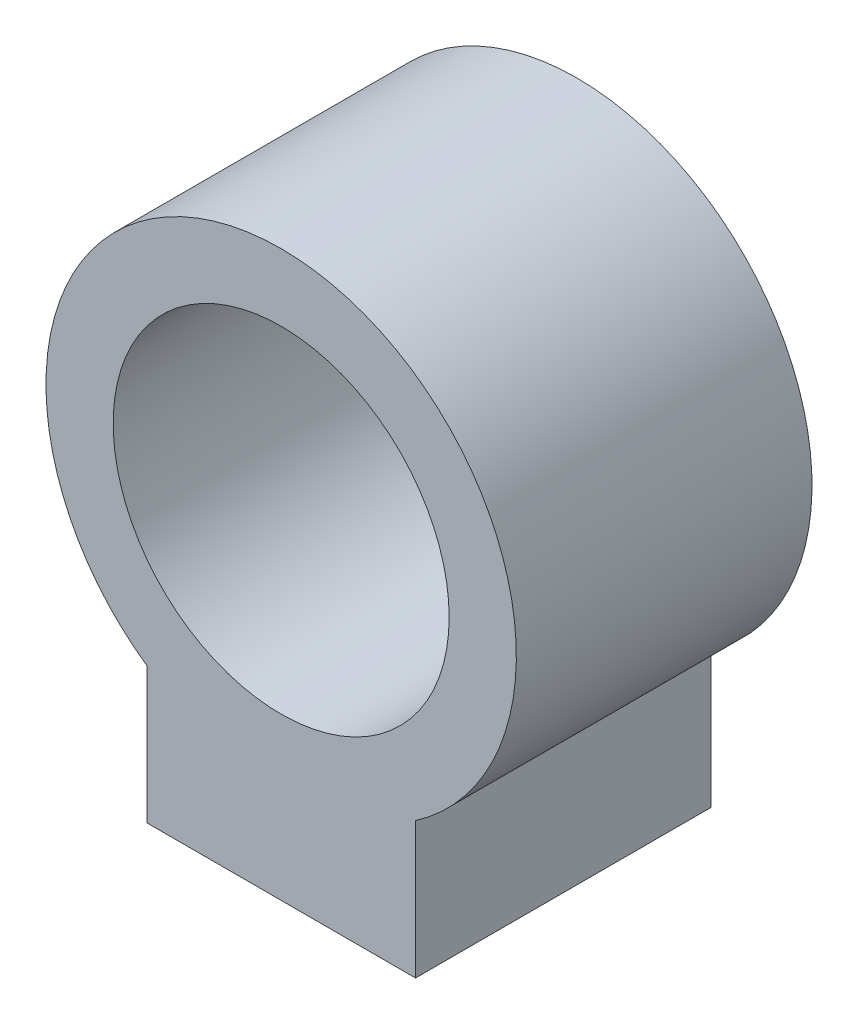
ISO-10303-21;
HEADER;
FILE_DESCRIPTION(('STEP AP214'),'2;1');
FILE_NAME('part.step','',(''),(''),'','','');
FILE_SCHEMA(('AUTOMOTIVE_DESIGN { 1 0 10303 214 1 1 1 1 }'));
ENDSEC;
DATA;
#1=APPLICATION_CONTEXT('core data for automotive mechanical design processes');
#2=APPLICATION_PROTOCOL_DEFINITION('international standard','automotive_design',2000,#1);
#3=PRODUCT_CONTEXT('',#1,'mechanical');
#4=PRODUCT('Part','Part','',(#3));
#5=PRODUCT_RELATED_PRODUCT_CATEGORY('part','',(#4));
#6=PRODUCT_DEFINITION_FORMATION('','',#4);
#7=PRODUCT_DEFINITION_CONTEXT('part definition',#1,'design');
#8=PRODUCT_DEFINITION('design','',#6,#7);
#9=PRODUCT_DEFINITION_SHAPE('','',#8);
#10=(LENGTH_UNIT() NAMED_UNIT(*) SI_UNIT(.MILLI.,.METRE.));
#11=(NAMED_UNIT(*) PLANE_ANGLE_UNIT() SI_UNIT($,.RADIAN.));
#12=(NAMED_UNIT(*) SI_UNIT($,.STERADIAN.) SOLID_ANGLE_UNIT());
#13=UNCERTAINTY_MEASURE_WITH_UNIT(LENGTH_MEASURE(1.E-05),#10,'distance_accuracy_value','');
#14=(GEOMETRIC_REPRESENTATION_CONTEXT(3) GLOBAL_UNCERTAINTY_ASSIGNED_CONTEXT((#13)) GLOBAL_UNIT_ASSIGNED_CONTEXT((#10,
#11,#12)) REPRESENTATION_CONTEXT('',''));
#15=CARTESIAN_POINT('',(0.,0.,0.));
#16=DIRECTION('',(0.,0.,1.));
#17=DIRECTION('',(1.,0.,0.));
#18=AXIS2_PLACEMENT_3D('',#15,#16,#17);
#19=CARTESIAN_POINT('',(0.,17.,11.));
#20=DIRECTION('',(0.,0.,-1.));
#21=DIRECTION('',(-1.,0.,0.));
#22=AXIS2_PLACEMENT_3D('',#19,#20,#21);
#23=CYLINDRICAL_SURFACE('',#22,17.5);
#24=CARTESIAN_POINT('',(0.,17.,-11.));
#25=DIRECTION('',(0.,0.,1.));
#26=DIRECTION('',(1.,0.,0.));
#27=AXIS2_PLACEMENT_3D('',#24,#25,#26);
#28=CIRCLE('',#27,17.5);
#29=CARTESIAN_POINT('',(10.,2.63859338365493,-11.));
#30=VERTEX_POINT('',#29);
#31=CARTESIAN_POINT('',(-10.,2.63859338365493,-11.));
#32=VERTEX_POINT('',#31);
#33=EDGE_CURVE('E106',#30,#32,#28,.T.);
#34=ORIENTED_EDGE('',*,*,#33,.T.);
#35=DIRECTION('',(0.,0.,-1.));
#36=VECTOR('',#35,1.);
#37=CARTESIAN_POINT('',(-10.,2.63859338365493,11.));
#38=LINE('',#37,#36);
#39=CARTESIAN_POINT('',(-10.,2.63859338365493,11.));
#40=VERTEX_POINT('',#39);
#41=EDGE_CURVE('E11',#40,#32,#38,.T.);
#42=ORIENTED_EDGE('',*,*,#41,.F.);
#43=CARTESIAN_POINT('',(0.,17.,11.));
#44=DIRECTION('',(0.,0.,1.));
#45=DIRECTION('',(1.,0.,0.));
#46=AXIS2_PLACEMENT_3D('',#43,#44,#45);
#47=CIRCLE('',#46,17.5);
#48=CARTESIAN_POINT('',(10.,2.63859338365493,11.));
#49=VERTEX_POINT('',#48);
#50=EDGE_CURVE('E89',#49,#40,#47,.T.);
#51=ORIENTED_EDGE('',*,*,#50,.F.);
#52=DIRECTION('',(0.,0.,-1.));
#53=VECTOR('',#52,1.);
#54=CARTESIAN_POINT('',(10.,2.63859338365493,11.));
#55=LINE('',#54,#53);
#56=EDGE_CURVE('E55',#49,#30,#55,.T.);
#57=ORIENTED_EDGE('',*,*,#56,.T.);
#58=EDGE_LOOP('',(#34,#42,#51,#57));
#59=FACE_BOUND('',#58,.T.);
#60=ADVANCED_FACE('F39',(#59),#23,.T.);
#61=CARTESIAN_POINT('',(-10.,0.,11.));
#62=DIRECTION('',(1.,0.,0.));
#63=DIRECTION('',(0.,1.,0.));
#64=AXIS2_PLACEMENT_3D('',#61,#62,#63);
#65=PLANE('',#64);
#66=DIRECTION('',(0.,-1.,0.));
#67=VECTOR('',#66,1.);
#68=CARTESIAN_POINT('',(-10.,0.,-11.));
#69=LINE('',#68,#67);
#70=CARTESIAN_POINT('',(-10.,-7.5,-11.));
#71=VERTEX_POINT('',#70);
#72=EDGE_CURVE('E94',#32,#71,#69,.T.);
#73=ORIENTED_EDGE('',*,*,#72,.T.);
#74=DIRECTION('',(0.,0.,-1.));
#75=VECTOR('',#74,1.);
#76=CARTESIAN_POINT('',(-10.,-7.5,11.));
#77=LINE('',#76,#75);
#78=CARTESIAN_POINT('',(-10.,-7.5,11.));
#79=VERTEX_POINT('',#78);
#80=EDGE_CURVE('E47',#79,#71,#77,.T.);
#81=ORIENTED_EDGE('',*,*,#80,.F.);
#82=DIRECTION('',(0.,-1.,0.));
#83=VECTOR('',#82,1.);
#84=CARTESIAN_POINT('',(-10.,0.,11.));
#85=LINE('',#84,#83);
#86=EDGE_CURVE('E81',#40,#79,#85,.T.);
#87=ORIENTED_EDGE('',*,*,#86,.F.);
#88=ORIENTED_EDGE('',*,*,#41,.T.);
#89=EDGE_LOOP('',(#73,#81,#87,#88));
#90=FACE_BOUND('',#89,.T.);
#91=ADVANCED_FACE('F93',(#90),#65,.F.);
#92=CARTESIAN_POINT('',(0.,-7.5,11.));
#93=DIRECTION('',(0.,1.,0.));
#94=DIRECTION('',(0.,0.,1.));
#95=AXIS2_PLACEMENT_3D('',#92,#93,#94);
#96=PLANE('',#95);
#97=DIRECTION('',(1.,0.,0.));
#98=VECTOR('',#97,1.);
#99=CARTESIAN_POINT('',(0.,-7.5,-11.));
#100=LINE('',#99,#98);
#101=CARTESIAN_POINT('',(10.,-7.5,-11.));
#102=VERTEX_POINT('',#101);
#103=EDGE_CURVE('E109',#71,#102,#100,.T.);
#104=ORIENTED_EDGE('',*,*,#103,.T.);
#105=DIRECTION('',(0.,0.,-1.));
#106=VECTOR('',#105,1.);
#107=CARTESIAN_POINT('',(10.,-7.5,11.));
#108=LINE('',#107,#106);
#109=CARTESIAN_POINT('',(10.,-7.5,11.));
#110=VERTEX_POINT('',#109);
#111=EDGE_CURVE('E70',#110,#102,#108,.T.);
#112=ORIENTED_EDGE('',*,*,#111,.F.);
#113=DIRECTION('',(1.,0.,0.));
#114=VECTOR('',#113,1.);
#115=CARTESIAN_POINT('',(0.,-7.5,11.));
#116=LINE('',#115,#114);
#117=EDGE_CURVE('E88',#79,#110,#116,.T.);
#118=ORIENTED_EDGE('',*,*,#117,.F.);
#119=ORIENTED_EDGE('',*,*,#80,.T.);
#120=EDGE_LOOP('',(#104,#112,#118,#119));
#121=FACE_BOUND('',#120,.T.);
#122=ADVANCED_FACE('F97',(#121),#96,.F.);
#123=CARTESIAN_POINT('',(10.,0.,11.));
#124=DIRECTION('',(1.,0.,0.));
#125=DIRECTION('',(0.,1.,0.));
#126=AXIS2_PLACEMENT_3D('',#123,#124,#125);
#127=PLANE('',#126);
#128=DIRECTION('',(0.,-1.,0.));
#129=VECTOR('',#128,1.);
#130=CARTESIAN_POINT('',(10.,0.,-11.));
#131=LINE('',#130,#129);
#132=EDGE_CURVE('E111',#30,#102,#131,.T.);
#133=ORIENTED_EDGE('',*,*,#132,.F.);
#134=ORIENTED_EDGE('',*,*,#56,.F.);
#135=DIRECTION('',(0.,-1.,0.));
#136=VECTOR('',#135,1.);
#137=CARTESIAN_POINT('',(10.,0.,11.));
#138=LINE('',#137,#136);
#139=EDGE_CURVE('E98',#49,#110,#138,.T.);
#140=ORIENTED_EDGE('',*,*,#139,.T.);
#141=ORIENTED_EDGE('',*,*,#111,.T.);
#142=EDGE_LOOP('',(#133,#134,#140,#141));
#143=FACE_BOUND('',#142,.T.);
#144=ADVANCED_FACE('F124',(#143),#127,.T.);
#145=CARTESIAN_POINT('',(0.,17.,11.));
#146=DIRECTION('',(0.,0.,-1.));
#147=DIRECTION('',(-1.,0.,0.));
#148=AXIS2_PLACEMENT_3D('',#145,#146,#147);
#149=CYLINDRICAL_SURFACE('',#148,12.5);
#150=CARTESIAN_POINT('',(0.,17.,11.));
#151=DIRECTION('',(0.,0.,1.));
#152=DIRECTION('',(1.,0.,0.));
#153=AXIS2_PLACEMENT_3D('',#150,#151,#152);
#154=CIRCLE('',#153,12.5);
#155=CARTESIAN_POINT('',(12.5,17.,11.));
#156=VERTEX_POINT('',#155);
#157=EDGE_CURVE('E100',#156,#156,#154,.T.);
#158=ORIENTED_EDGE('',*,*,#157,.T.);
#159=EDGE_LOOP('',(#158));
#160=FACE_BOUND('',#159,.T.);
#161=CARTESIAN_POINT('',(0.,17.,-11.));
#162=DIRECTION('',(0.,0.,1.));
#163=DIRECTION('',(1.,0.,0.));
#164=AXIS2_PLACEMENT_3D('',#161,#162,#163);
#165=CIRCLE('',#164,12.5);
#166=CARTESIAN_POINT('',(12.5,17.,-11.));
#167=VERTEX_POINT('',#166);
#168=EDGE_CURVE('E114',#167,#167,#165,.T.);
#169=ORIENTED_EDGE('',*,*,#168,.F.);
#170=EDGE_LOOP('',(#169));
#171=FACE_BOUND('',#170,.T.);
#172=ADVANCED_FACE('F122',(#160,#171),#149,.F.);
#173=CARTESIAN_POINT('',(0.,0.,11.));
#174=DIRECTION('',(0.,0.,1.));
#175=DIRECTION('',(1.,0.,0.));
#176=AXIS2_PLACEMENT_3D('',#173,#174,#175);
#177=PLANE('',#176);
#178=ORIENTED_EDGE('',*,*,#50,.T.);
#179=ORIENTED_EDGE('',*,*,#86,.T.);
#180=ORIENTED_EDGE('',*,*,#117,.T.);
#181=ORIENTED_EDGE('',*,*,#139,.F.);
#182=EDGE_LOOP('',(#178,#179,#180,#181));
#183=FACE_BOUND('',#182,.T.);
#184=ORIENTED_EDGE('',*,*,#157,.F.);
#185=EDGE_LOOP('',(#184));
#186=FACE_BOUND('',#185,.T.);
#187=ADVANCED_FACE('F84',(#183,#186),#177,.T.);
#188=CARTESIAN_POINT('',(0.,0.,-11.));
#189=DIRECTION('',(0.,0.,1.));
#190=DIRECTION('',(1.,0.,0.));
#191=AXIS2_PLACEMENT_3D('',#188,#189,#190);
#192=PLANE('',#191);
#193=ORIENTED_EDGE('',*,*,#33,.F.);
#194=ORIENTED_EDGE('',*,*,#132,.T.);
#195=ORIENTED_EDGE('',*,*,#103,.F.);
#196=ORIENTED_EDGE('',*,*,#72,.F.);
#197=EDGE_LOOP('',(#193,#194,#195,#196));
#198=FACE_BOUND('',#197,.T.);
#199=ORIENTED_EDGE('',*,*,#168,.T.);
#200=EDGE_LOOP('',(#199));
#201=FACE_BOUND('',#200,.T.);
#202=ADVANCED_FACE('F120',(#198,#201),#192,.F.);
#203=CLOSED_SHELL('',(#60,#91,#122,#144,#172,#187,#202));
#204=MANIFOLD_SOLID_BREP('B2',#203);
#205=ADVANCED_BREP_SHAPE_REPRESENTATION('',(#18,#204),#14);
#206=SHAPE_DEFINITION_REPRESENTATION(#9,#205);
ENDSEC;
END-ISO-10303-21;
